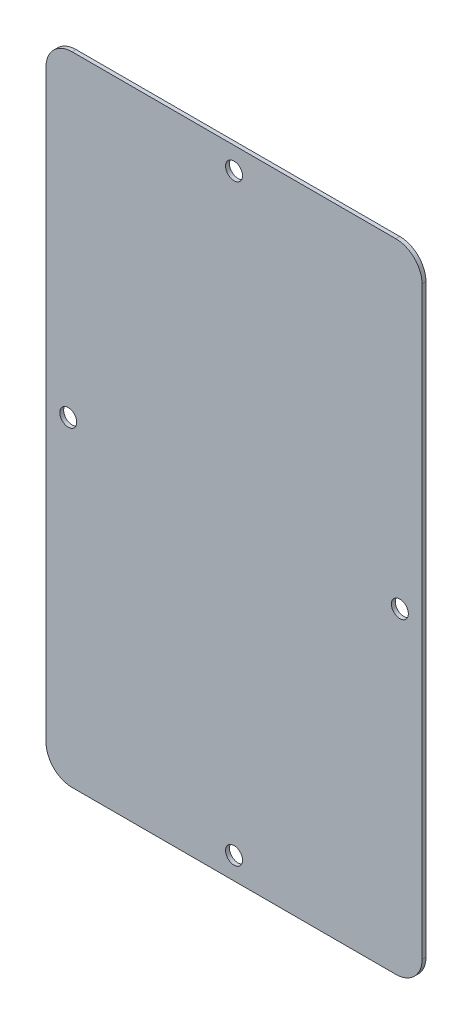
ISO-10303-21;
HEADER;
FILE_DESCRIPTION(('STEP AP214'),'2;1');
FILE_NAME('part.step','',(''),(''),'','','');
FILE_SCHEMA(('AUTOMOTIVE_DESIGN { 1 0 10303 214 1 1 1 1 }'));
ENDSEC;
DATA;
#1=APPLICATION_CONTEXT('core data for automotive mechanical design processes');
#2=APPLICATION_PROTOCOL_DEFINITION('international standard','automotive_design',2000,#1);
#3=PRODUCT_CONTEXT('',#1,'mechanical');
#4=PRODUCT('Part','Part','',(#3));
#5=PRODUCT_RELATED_PRODUCT_CATEGORY('part','',(#4));
#6=PRODUCT_DEFINITION_FORMATION('','',#4);
#7=PRODUCT_DEFINITION_CONTEXT('part definition',#1,'design');
#8=PRODUCT_DEFINITION('design','',#6,#7);
#9=PRODUCT_DEFINITION_SHAPE('','',#8);
#10=(LENGTH_UNIT() NAMED_UNIT(*) SI_UNIT(.MILLI.,.METRE.));
#11=(NAMED_UNIT(*) PLANE_ANGLE_UNIT() SI_UNIT($,.RADIAN.));
#12=(NAMED_UNIT(*) SI_UNIT($,.STERADIAN.) SOLID_ANGLE_UNIT());
#13=UNCERTAINTY_MEASURE_WITH_UNIT(LENGTH_MEASURE(1.E-05),#10,'distance_accuracy_value','');
#14=(GEOMETRIC_REPRESENTATION_CONTEXT(3) GLOBAL_UNCERTAINTY_ASSIGNED_CONTEXT((#13)) GLOBAL_UNIT_ASSIGNED_CONTEXT((#10,
#11,#12)) REPRESENTATION_CONTEXT('',''));
#15=CARTESIAN_POINT('',(0.,0.,0.));
#16=DIRECTION('',(0.,0.,1.));
#17=DIRECTION('',(1.,0.,0.));
#18=AXIS2_PLACEMENT_3D('',#15,#16,#17);
#19=CARTESIAN_POINT('',(0.,0.,-1.5));
#20=DIRECTION('',(-1.,0.,0.));
#21=DIRECTION('',(0.,-1.,0.));
#22=AXIS2_PLACEMENT_3D('',#19,#20,#21);
#23=PLANE('',#22);
#24=DIRECTION('',(0.,-1.,0.));
#25=VECTOR('',#24,1.);
#26=CARTESIAN_POINT('',(0.,0.,0.));
#27=LINE('',#26,#25);
#28=CARTESIAN_POINT('',(-2.77555756156289E-13,234.,0.));
#29=VERTEX_POINT('',#28);
#30=CARTESIAN_POINT('',(0.,9.99999999999999,0.));
#31=VERTEX_POINT('',#30);
#32=EDGE_CURVE('E164',#29,#31,#27,.T.);
#33=ORIENTED_EDGE('',*,*,#32,.F.);
#34=DIRECTION('',(0.,0.,0.999999999999995));
#35=VECTOR('',#34,1.);
#36=CARTESIAN_POINT('',(-2.77555756156289E-13,234.,-1.5));
#37=LINE('',#36,#35);
#38=CARTESIAN_POINT('',(-2.77555756156289E-13,234.,-1.5));
#39=VERTEX_POINT('',#38);
#40=EDGE_CURVE('E144',#29,#39,#37,.F.);
#41=ORIENTED_EDGE('',*,*,#40,.T.);
#42=DIRECTION('',(0.,-1.,0.));
#43=VECTOR('',#42,1.);
#44=CARTESIAN_POINT('',(0.,0.,-1.5));
#45=LINE('',#44,#43);
#46=CARTESIAN_POINT('',(0.,9.99999999999999,-1.5));
#47=VERTEX_POINT('',#46);
#48=EDGE_CURVE('E125',#39,#47,#45,.T.);
#49=ORIENTED_EDGE('',*,*,#48,.T.);
#50=DIRECTION('',(0.,0.,0.999999999999995));
#51=VECTOR('',#50,1.);
#52=CARTESIAN_POINT('',(0.,10.,-1.5));
#53=LINE('',#52,#51);
#54=EDGE_CURVE('E141',#47,#31,#53,.T.);
#55=ORIENTED_EDGE('',*,*,#54,.T.);
#56=EDGE_LOOP('',(#33,#41,#49,#55));
#57=FACE_BOUND('',#56,.T.);
#58=ADVANCED_FACE('F39',(#57),#23,.T.);
#59=CARTESIAN_POINT('',(-2.77555756156289E-13,244.,-1.5));
#60=DIRECTION('',(0.,1.,0.));
#61=DIRECTION('',(0.,0.,0.999999999999995));
#62=AXIS2_PLACEMENT_3D('',#59,#60,#61);
#63=PLANE('',#62);
#64=DIRECTION('',(-1.,0.,0.));
#65=VECTOR('',#64,1.);
#66=CARTESIAN_POINT('',(-2.77555756156289E-13,244.,-1.5));
#67=LINE('',#66,#65);
#68=CARTESIAN_POINT('',(134.,244.,-1.5));
#69=VERTEX_POINT('',#68);
#70=CARTESIAN_POINT('',(9.99999999999973,244.,-1.5));
#71=VERTEX_POINT('',#70);
#72=EDGE_CURVE('E129',#69,#71,#67,.T.);
#73=ORIENTED_EDGE('',*,*,#72,.T.);
#74=DIRECTION('',(0.,0.,0.999999999999995));
#75=VECTOR('',#74,1.);
#76=CARTESIAN_POINT('',(9.99999999999973,244.,-1.5));
#77=LINE('',#76,#75);
#78=CARTESIAN_POINT('',(9.99999999999973,244.,0.));
#79=VERTEX_POINT('',#78);
#80=EDGE_CURVE('E116',#71,#79,#77,.T.);
#81=ORIENTED_EDGE('',*,*,#80,.T.);
#82=DIRECTION('',(-1.,0.,0.));
#83=VECTOR('',#82,1.);
#84=CARTESIAN_POINT('',(-2.77555756156289E-13,244.,0.));
#85=LINE('',#84,#83);
#86=CARTESIAN_POINT('',(134.,244.,0.));
#87=VERTEX_POINT('',#86);
#88=EDGE_CURVE('E108',#87,#79,#85,.T.);
#89=ORIENTED_EDGE('',*,*,#88,.F.);
#90=DIRECTION('',(0.,0.,0.999999999999995));
#91=VECTOR('',#90,1.);
#92=CARTESIAN_POINT('',(134.,244.,-1.5));
#93=LINE('',#92,#91);
#94=EDGE_CURVE('E122',#87,#69,#93,.F.);
#95=ORIENTED_EDGE('',*,*,#94,.T.);
#96=EDGE_LOOP('',(#73,#81,#89,#95));
#97=FACE_BOUND('',#96,.T.);
#98=ADVANCED_FACE('F121',(#97),#63,.T.);
#99=CARTESIAN_POINT('',(144.,0.,-1.5));
#100=DIRECTION('',(1.,0.,0.));
#101=DIRECTION('',(0.,1.,0.));
#102=AXIS2_PLACEMENT_3D('',#99,#100,#101);
#103=PLANE('',#102);
#104=DIRECTION('',(0.,1.,0.));
#105=VECTOR('',#104,1.);
#106=CARTESIAN_POINT('',(144.,0.,0.));
#107=LINE('',#106,#105);
#108=CARTESIAN_POINT('',(144.,10.,0.));
#109=VERTEX_POINT('',#108);
#110=CARTESIAN_POINT('',(144.,234.,0.));
#111=VERTEX_POINT('',#110);
#112=EDGE_CURVE('E110',#109,#111,#107,.T.);
#113=ORIENTED_EDGE('',*,*,#112,.F.);
#114=DIRECTION('',(0.,0.,0.999999999999995));
#115=VECTOR('',#114,1.);
#116=CARTESIAN_POINT('',(144.,10.,-1.5));
#117=LINE('',#116,#115);
#118=CARTESIAN_POINT('',(144.,10.,-1.5));
#119=VERTEX_POINT('',#118);
#120=EDGE_CURVE('E11',#109,#119,#117,.F.);
#121=ORIENTED_EDGE('',*,*,#120,.T.);
#122=DIRECTION('',(0.,1.,0.));
#123=VECTOR('',#122,1.);
#124=CARTESIAN_POINT('',(144.,0.,-1.5));
#125=LINE('',#124,#123);
#126=CARTESIAN_POINT('',(144.,234.,-1.5));
#127=VERTEX_POINT('',#126);
#128=EDGE_CURVE('E132',#119,#127,#125,.T.);
#129=ORIENTED_EDGE('',*,*,#128,.T.);
#130=DIRECTION('',(0.,0.,0.999999999999995));
#131=VECTOR('',#130,1.);
#132=CARTESIAN_POINT('',(144.,234.,-1.5));
#133=LINE('',#132,#131);
#134=EDGE_CURVE('E47',#127,#111,#133,.T.);
#135=ORIENTED_EDGE('',*,*,#134,.T.);
#136=EDGE_LOOP('',(#113,#121,#129,#135));
#137=FACE_BOUND('',#136,.T.);
#138=ADVANCED_FACE('F157',(#137),#103,.T.);
#139=CARTESIAN_POINT('',(0.,0.,-1.5));
#140=DIRECTION('',(0.,-1.,0.));
#141=DIRECTION('',(0.,0.,-0.999999999999995));
#142=AXIS2_PLACEMENT_3D('',#139,#140,#141);
#143=PLANE('',#142);
#144=DIRECTION('',(1.,0.,0.));
#145=VECTOR('',#144,1.);
#146=CARTESIAN_POINT('',(0.,0.,0.));
#147=LINE('',#146,#145);
#148=CARTESIAN_POINT('',(10.,0.,0.));
#149=VERTEX_POINT('',#148);
#150=CARTESIAN_POINT('',(134.,0.,0.));
#151=VERTEX_POINT('',#150);
#152=EDGE_CURVE('E167',#149,#151,#147,.T.);
#153=ORIENTED_EDGE('',*,*,#152,.F.);
#154=DIRECTION('',(0.,0.,0.999999999999995));
#155=VECTOR('',#154,1.);
#156=CARTESIAN_POINT('',(10.,0.,-1.5));
#157=LINE('',#156,#155);
#158=CARTESIAN_POINT('',(10.,0.,-1.5));
#159=VERTEX_POINT('',#158);
#160=EDGE_CURVE('E61',#149,#159,#157,.F.);
#161=ORIENTED_EDGE('',*,*,#160,.T.);
#162=DIRECTION('',(1.,0.,0.));
#163=VECTOR('',#162,1.);
#164=CARTESIAN_POINT('',(0.,0.,-1.5));
#165=LINE('',#164,#163);
#166=CARTESIAN_POINT('',(134.,0.,-1.5));
#167=VERTEX_POINT('',#166);
#168=EDGE_CURVE('E159',#159,#167,#165,.T.);
#169=ORIENTED_EDGE('',*,*,#168,.T.);
#170=DIRECTION('',(0.,0.,0.999999999999995));
#171=VECTOR('',#170,1.);
#172=CARTESIAN_POINT('',(134.,0.,-1.5));
#173=LINE('',#172,#171);
#174=EDGE_CURVE('E152',#167,#151,#173,.T.);
#175=ORIENTED_EDGE('',*,*,#174,.T.);
#176=EDGE_LOOP('',(#153,#161,#169,#175));
#177=FACE_BOUND('',#176,.T.);
#178=ADVANCED_FACE('F170',(#177),#143,.T.);
#179=CARTESIAN_POINT('',(0.,0.,-1.5));
#180=DIRECTION('',(0.,0.,-0.999999999999995));
#181=DIRECTION('',(-1.,0.,0.));
#182=AXIS2_PLACEMENT_3D('',#179,#180,#181);
#183=PLANE('',#182);
#184=CARTESIAN_POINT('',(72.,235.5,-1.5));
#185=DIRECTION('',(0.,0.,-0.999999999999995));
#186=DIRECTION('',(-1.,0.,0.));
#187=AXIS2_PLACEMENT_3D('',#184,#185,#186);
#188=CIRCLE('',#187,3.25000000000001);
#189=CARTESIAN_POINT('',(75.25,235.5,-1.5));
#190=VERTEX_POINT('',#189);
#191=EDGE_CURVE('E168',#190,#190,#188,.T.);
#192=ORIENTED_EDGE('',*,*,#191,.F.);
#193=EDGE_LOOP('',(#192));
#194=FACE_BOUND('',#193,.T.);
#195=CARTESIAN_POINT('',(72.,8.5,-1.5));
#196=DIRECTION('',(0.,0.,-0.999999999999995));
#197=DIRECTION('',(-1.,0.,0.));
#198=AXIS2_PLACEMENT_3D('',#195,#196,#197);
#199=CIRCLE('',#198,3.25000000000001);
#200=CARTESIAN_POINT('',(75.25,8.5,-1.5));
#201=VERTEX_POINT('',#200);
#202=EDGE_CURVE('E186',#201,#201,#199,.T.);
#203=ORIENTED_EDGE('',*,*,#202,.F.);
#204=EDGE_LOOP('',(#203));
#205=FACE_BOUND('',#204,.T.);
#206=CARTESIAN_POINT('',(8.49999999999995,122.,-1.5));
#207=DIRECTION('',(0.,0.,-0.999999999999995));
#208=DIRECTION('',(-1.,0.,0.));
#209=AXIS2_PLACEMENT_3D('',#206,#207,#208);
#210=CIRCLE('',#209,3.25);
#211=CARTESIAN_POINT('',(11.75,122.,-1.5));
#212=VERTEX_POINT('',#211);
#213=EDGE_CURVE('E189',#212,#212,#210,.T.);
#214=ORIENTED_EDGE('',*,*,#213,.F.);
#215=EDGE_LOOP('',(#214));
#216=FACE_BOUND('',#215,.T.);
#217=CARTESIAN_POINT('',(135.5,122.,-1.5));
#218=DIRECTION('',(0.,0.,-0.999999999999995));
#219=DIRECTION('',(-1.,0.,0.));
#220=AXIS2_PLACEMENT_3D('',#217,#218,#219);
#221=CIRCLE('',#220,3.25000000000001);
#222=CARTESIAN_POINT('',(138.75,122.,-1.5));
#223=VERTEX_POINT('',#222);
#224=EDGE_CURVE('E192',#223,#223,#221,.T.);
#225=ORIENTED_EDGE('',*,*,#224,.F.);
#226=EDGE_LOOP('',(#225));
#227=FACE_BOUND('',#226,.T.);
#228=ORIENTED_EDGE('',*,*,#48,.F.);
#229=CARTESIAN_POINT('',(9.99999999999973,234.,-1.5));
#230=DIRECTION('',(0.,0.,-0.999999999999995));
#231=DIRECTION('',(-1.,0.,0.));
#232=AXIS2_PLACEMENT_3D('',#229,#230,#231);
#233=CIRCLE('',#232,10.);
#234=EDGE_CURVE('E150',#39,#71,#233,.T.);
#235=ORIENTED_EDGE('',*,*,#234,.T.);
#236=ORIENTED_EDGE('',*,*,#72,.F.);
#237=CARTESIAN_POINT('',(134.,234.,-1.5));
#238=DIRECTION('',(0.,0.,-0.999999999999995));
#239=DIRECTION('',(-1.,0.,0.));
#240=AXIS2_PLACEMENT_3D('',#237,#238,#239);
#241=CIRCLE('',#240,10.);
#242=EDGE_CURVE('E128',#69,#127,#241,.T.);
#243=ORIENTED_EDGE('',*,*,#242,.T.);
#244=ORIENTED_EDGE('',*,*,#128,.F.);
#245=CARTESIAN_POINT('',(134.,10.,-1.5));
#246=DIRECTION('',(0.,0.,-0.999999999999995));
#247=DIRECTION('',(-1.,0.,0.));
#248=AXIS2_PLACEMENT_3D('',#245,#246,#247);
#249=CIRCLE('',#248,10.);
#250=EDGE_CURVE('E54',#119,#167,#249,.T.);
#251=ORIENTED_EDGE('',*,*,#250,.T.);
#252=ORIENTED_EDGE('',*,*,#168,.F.);
#253=CARTESIAN_POINT('',(10.,10.,-1.5));
#254=DIRECTION('',(0.,0.,-0.999999999999995));
#255=DIRECTION('',(-1.,0.,0.));
#256=AXIS2_PLACEMENT_3D('',#253,#254,#255);
#257=CIRCLE('',#256,10.);
#258=EDGE_CURVE('E148',#159,#47,#257,.T.);
#259=ORIENTED_EDGE('',*,*,#258,.T.);
#260=EDGE_LOOP('',(#228,#235,#236,#243,#244,#251,#252,#259));
#261=FACE_BOUND('',#260,.T.);
#262=ADVANCED_FACE('F178',(#194,#205,#216,#227,#261),#183,.T.);
#263=CARTESIAN_POINT('',(0.,0.,0.));
#264=DIRECTION('',(0.,0.,-0.999999999999995));
#265=DIRECTION('',(-1.,0.,0.));
#266=AXIS2_PLACEMENT_3D('',#263,#264,#265);
#267=PLANE('',#266);
#268=CARTESIAN_POINT('',(72.,235.5,0.));
#269=DIRECTION('',(0.,0.,0.999999999999995));
#270=DIRECTION('',(1.,0.,0.));
#271=AXIS2_PLACEMENT_3D('',#268,#269,#270);
#272=CIRCLE('',#271,3.25000000000001);
#273=CARTESIAN_POINT('',(75.25,235.5,0.));
#274=VERTEX_POINT('',#273);
#275=EDGE_CURVE('E195',#274,#274,#272,.T.);
#276=ORIENTED_EDGE('',*,*,#275,.F.);
#277=EDGE_LOOP('',(#276));
#278=FACE_BOUND('',#277,.T.);
#279=CARTESIAN_POINT('',(72.,8.5,0.));
#280=DIRECTION('',(0.,0.,0.999999999999995));
#281=DIRECTION('',(1.,0.,0.));
#282=AXIS2_PLACEMENT_3D('',#279,#280,#281);
#283=CIRCLE('',#282,3.25000000000001);
#284=CARTESIAN_POINT('',(75.25,8.5,0.));
#285=VERTEX_POINT('',#284);
#286=EDGE_CURVE('E202',#285,#285,#283,.T.);
#287=ORIENTED_EDGE('',*,*,#286,.F.);
#288=EDGE_LOOP('',(#287));
#289=FACE_BOUND('',#288,.T.);
#290=CARTESIAN_POINT('',(8.49999999999995,122.,0.));
#291=DIRECTION('',(0.,0.,0.999999999999995));
#292=DIRECTION('',(1.,0.,0.));
#293=AXIS2_PLACEMENT_3D('',#290,#291,#292);
#294=CIRCLE('',#293,3.25);
#295=CARTESIAN_POINT('',(11.75,122.,0.));
#296=VERTEX_POINT('',#295);
#297=EDGE_CURVE('E199',#296,#296,#294,.T.);
#298=ORIENTED_EDGE('',*,*,#297,.F.);
#299=EDGE_LOOP('',(#298));
#300=FACE_BOUND('',#299,.T.);
#301=CARTESIAN_POINT('',(135.5,122.,0.));
#302=DIRECTION('',(0.,0.,0.999999999999995));
#303=DIRECTION('',(1.,0.,0.));
#304=AXIS2_PLACEMENT_3D('',#301,#302,#303);
#305=CIRCLE('',#304,3.25000000000001);
#306=CARTESIAN_POINT('',(138.75,122.,0.));
#307=VERTEX_POINT('',#306);
#308=EDGE_CURVE('E196',#307,#307,#305,.T.);
#309=ORIENTED_EDGE('',*,*,#308,.F.);
#310=EDGE_LOOP('',(#309));
#311=FACE_BOUND('',#310,.T.);
#312=ORIENTED_EDGE('',*,*,#88,.T.);
#313=CARTESIAN_POINT('',(9.99999999999973,234.,0.));
#314=DIRECTION('',(0.,0.,-0.999999999999995));
#315=DIRECTION('',(-1.,0.,0.));
#316=AXIS2_PLACEMENT_3D('',#313,#314,#315);
#317=CIRCLE('',#316,10.);
#318=EDGE_CURVE('E139',#79,#29,#317,.F.);
#319=ORIENTED_EDGE('',*,*,#318,.T.);
#320=ORIENTED_EDGE('',*,*,#32,.T.);
#321=CARTESIAN_POINT('',(10.,10.,0.));
#322=DIRECTION('',(0.,0.,-0.999999999999995));
#323=DIRECTION('',(-1.,0.,0.));
#324=AXIS2_PLACEMENT_3D('',#321,#322,#323);
#325=CIRCLE('',#324,10.);
#326=EDGE_CURVE('E137',#31,#149,#325,.F.);
#327=ORIENTED_EDGE('',*,*,#326,.T.);
#328=ORIENTED_EDGE('',*,*,#152,.T.);
#329=CARTESIAN_POINT('',(134.,10.,0.));
#330=DIRECTION('',(0.,0.,-0.999999999999995));
#331=DIRECTION('',(-1.,0.,0.));
#332=AXIS2_PLACEMENT_3D('',#329,#330,#331);
#333=CIRCLE('',#332,10.);
#334=EDGE_CURVE('E115',#151,#109,#333,.F.);
#335=ORIENTED_EDGE('',*,*,#334,.T.);
#336=ORIENTED_EDGE('',*,*,#112,.T.);
#337=CARTESIAN_POINT('',(134.,234.,0.));
#338=DIRECTION('',(0.,0.,-0.999999999999995));
#339=DIRECTION('',(-1.,0.,0.));
#340=AXIS2_PLACEMENT_3D('',#337,#338,#339);
#341=CIRCLE('',#340,10.);
#342=EDGE_CURVE('E105',#111,#87,#341,.F.);
#343=ORIENTED_EDGE('',*,*,#342,.T.);
#344=EDGE_LOOP('',(#312,#319,#320,#327,#328,#335,#336,#343));
#345=FACE_BOUND('',#344,.T.);
#346=ADVANCED_FACE('F107',(#278,#289,#300,#311,#345),#267,.F.);
#347=CARTESIAN_POINT('',(9.99999999999973,234.,-1.5));
#348=DIRECTION('',(0.,0.,0.999999999999995));
#349=DIRECTION('',(1.,0.,0.));
#350=AXIS2_PLACEMENT_3D('',#347,#348,#349);
#351=CYLINDRICAL_SURFACE('',#350,10.);
#352=ORIENTED_EDGE('',*,*,#234,.F.);
#353=ORIENTED_EDGE('',*,*,#40,.F.);
#354=ORIENTED_EDGE('',*,*,#318,.F.);
#355=ORIENTED_EDGE('',*,*,#80,.F.);
#356=EDGE_LOOP('',(#352,#353,#354,#355));
#357=FACE_BOUND('',#356,.T.);
#358=ADVANCED_FACE('F212',(#357),#351,.T.);
#359=CARTESIAN_POINT('',(10.,10.,-1.5));
#360=DIRECTION('',(0.,0.,0.999999999999995));
#361=DIRECTION('',(1.,0.,0.));
#362=AXIS2_PLACEMENT_3D('',#359,#360,#361);
#363=CYLINDRICAL_SURFACE('',#362,10.);
#364=ORIENTED_EDGE('',*,*,#258,.F.);
#365=ORIENTED_EDGE('',*,*,#160,.F.);
#366=ORIENTED_EDGE('',*,*,#326,.F.);
#367=ORIENTED_EDGE('',*,*,#54,.F.);
#368=EDGE_LOOP('',(#364,#365,#366,#367));
#369=FACE_BOUND('',#368,.T.);
#370=ADVANCED_FACE('F174',(#369),#363,.T.);
#371=CARTESIAN_POINT('',(134.,10.,-1.5));
#372=DIRECTION('',(0.,0.,0.999999999999995));
#373=DIRECTION('',(1.,0.,0.));
#374=AXIS2_PLACEMENT_3D('',#371,#372,#373);
#375=CYLINDRICAL_SURFACE('',#374,10.);
#376=ORIENTED_EDGE('',*,*,#250,.F.);
#377=ORIENTED_EDGE('',*,*,#120,.F.);
#378=ORIENTED_EDGE('',*,*,#334,.F.);
#379=ORIENTED_EDGE('',*,*,#174,.F.);
#380=EDGE_LOOP('',(#376,#377,#378,#379));
#381=FACE_BOUND('',#380,.T.);
#382=ADVANCED_FACE('F232',(#381),#375,.T.);
#383=CARTESIAN_POINT('',(134.,234.,-1.5));
#384=DIRECTION('',(0.,0.,0.999999999999995));
#385=DIRECTION('',(1.,0.,0.));
#386=AXIS2_PLACEMENT_3D('',#383,#384,#385);
#387=CYLINDRICAL_SURFACE('',#386,10.);
#388=ORIENTED_EDGE('',*,*,#242,.F.);
#389=ORIENTED_EDGE('',*,*,#94,.F.);
#390=ORIENTED_EDGE('',*,*,#342,.F.);
#391=ORIENTED_EDGE('',*,*,#134,.F.);
#392=EDGE_LOOP('',(#388,#389,#390,#391));
#393=FACE_BOUND('',#392,.T.);
#394=ADVANCED_FACE('F41',(#393),#387,.T.);
#395=CARTESIAN_POINT('',(135.5,122.,-10.));
#396=DIRECTION('',(0.,0.,0.999999999999995));
#397=DIRECTION('',(1.,0.,0.));
#398=AXIS2_PLACEMENT_3D('',#395,#396,#397);
#399=CYLINDRICAL_SURFACE('',#398,3.25000000000001);
#400=CARTESIAN_POINT('',(138.75,122.,-1.5));
#401=CARTESIAN_POINT('',(138.75,122.,-1.484375));
#402=CARTESIAN_POINT('',(138.75,122.,-1.46875));
#403=CARTESIAN_POINT('',(138.75,122.,-1.4375));
#404=CARTESIAN_POINT('',(138.75,122.,-1.421875));
#405=CARTESIAN_POINT('',(138.75,122.,-1.390625));
#406=CARTESIAN_POINT('',(138.75,122.,-1.375));
#407=CARTESIAN_POINT('',(138.75,122.,-1.34375));
#408=CARTESIAN_POINT('',(138.75,122.,-1.328125));
#409=CARTESIAN_POINT('',(138.75,122.,-1.296875));
#410=CARTESIAN_POINT('',(138.75,122.,-1.28125));
#411=CARTESIAN_POINT('',(138.75,122.,-1.25));
#412=CARTESIAN_POINT('',(138.75,122.,-1.234375));
#413=CARTESIAN_POINT('',(138.75,122.,-1.203125));
#414=CARTESIAN_POINT('',(138.75,122.,-1.1875));
#415=CARTESIAN_POINT('',(138.75,122.,-1.15625));
#416=CARTESIAN_POINT('',(138.75,122.,-1.140625));
#417=CARTESIAN_POINT('',(138.75,122.,-1.109375));
#418=CARTESIAN_POINT('',(138.75,122.,-1.09375));
#419=CARTESIAN_POINT('',(138.75,122.,-1.0625));
#420=CARTESIAN_POINT('',(138.75,122.,-1.046875));
#421=CARTESIAN_POINT('',(138.75,122.,-1.015625));
#422=CARTESIAN_POINT('',(138.75,122.,-1.));
#423=CARTESIAN_POINT('',(138.75,122.,-0.968750000000001));
#424=CARTESIAN_POINT('',(138.75,122.,-0.953125000000001));
#425=CARTESIAN_POINT('',(138.75,122.,-0.921875000000001));
#426=CARTESIAN_POINT('',(138.75,122.,-0.906250000000001));
#427=CARTESIAN_POINT('',(138.75,122.,-0.875));
#428=CARTESIAN_POINT('',(138.75,122.,-0.859375));
#429=CARTESIAN_POINT('',(138.75,122.,-0.828124999999999));
#430=CARTESIAN_POINT('',(138.75,122.,-0.812499999999999));
#431=CARTESIAN_POINT('',(138.75,122.,-0.781249999999999));
#432=CARTESIAN_POINT('',(138.75,122.,-0.765624999999999));
#433=CARTESIAN_POINT('',(138.75,122.,-0.734374999999999));
#434=CARTESIAN_POINT('',(138.75,122.,-0.71875));
#435=CARTESIAN_POINT('',(138.75,122.,-0.687500000000001));
#436=CARTESIAN_POINT('',(138.75,122.,-0.671875000000001));
#437=CARTESIAN_POINT('',(138.75,122.,-0.640625));
#438=CARTESIAN_POINT('',(138.75,122.,-0.624999999999999));
#439=CARTESIAN_POINT('',(138.75,122.,-0.593749999999999));
#440=CARTESIAN_POINT('',(138.75,122.,-0.578124999999999));
#441=CARTESIAN_POINT('',(138.75,122.,-0.546874999999999));
#442=CARTESIAN_POINT('',(138.75,122.,-0.531249999999999));
#443=CARTESIAN_POINT('',(138.75,122.,-0.499999999999999));
#444=CARTESIAN_POINT('',(138.75,122.,-0.484374999999999));
#445=CARTESIAN_POINT('',(138.75,122.,-0.453124999999999));
#446=CARTESIAN_POINT('',(138.75,122.,-0.437499999999999));
#447=CARTESIAN_POINT('',(138.75,122.,-0.406249999999999));
#448=CARTESIAN_POINT('',(138.75,122.,-0.390625));
#449=CARTESIAN_POINT('',(138.75,122.,-0.359375));
#450=CARTESIAN_POINT('',(138.75,122.,-0.343749999999999));
#451=CARTESIAN_POINT('',(138.75,122.,-0.312499999999999));
#452=CARTESIAN_POINT('',(138.75,122.,-0.296874999999999));
#453=CARTESIAN_POINT('',(138.75,122.,-0.265624999999999));
#454=CARTESIAN_POINT('',(138.75,122.,-0.249999999999999));
#455=CARTESIAN_POINT('',(138.75,122.,-0.218749999999998));
#456=CARTESIAN_POINT('',(138.75,122.,-0.203124999999998));
#457=CARTESIAN_POINT('',(138.75,122.,-0.171874999999998));
#458=CARTESIAN_POINT('',(138.75,122.,-0.156249999999998));
#459=CARTESIAN_POINT('',(138.75,122.,-0.124999999999998));
#460=CARTESIAN_POINT('',(138.75,122.,-0.109374999999997));
#461=CARTESIAN_POINT('',(138.75,122.,-0.0781249999999972));
#462=CARTESIAN_POINT('',(138.75,122.,-0.0624999999999977));
#463=CARTESIAN_POINT('',(138.75,122.,-0.0312499999999983));
#464=CARTESIAN_POINT('',(138.75,122.,-0.0156249999999983));
#465=CARTESIAN_POINT('',(138.75,122.,0.));
#466=B_SPLINE_CURVE_WITH_KNOTS('',3,(#400,#401,#402,#403,#404,#405,#406,#407,#408,#409,#410,
#411,#412,#413,#414,#415,#416,#417,#418,#419,#420,#421,#422,#423,#424,#425,#426,#427,#428,#429,
#430,#431,#432,#433,#434,#435,#436,#437,#438,#439,#440,#441,#442,#443,#444,#445,#446,#447,#448,
#449,#450,#451,#452,#453,#454,#455,#456,#457,#458,#459,#460,#461,#462,#463,#464,#465),
.UNSPECIFIED.,.F.,.F.,(4,2,2,2,2,2,2,2,2,2,2,2,2,2,2,2,2,2,2,2,2,2,2,2,2,2,2,2,2,2,2,2,4),(0.,
0.046875,0.0937500000000001,0.140625,0.1875,0.234375,0.28125,0.328125,0.375000000000002,
0.421875000000002,0.46875,0.515625,0.5625,0.609375000000001,0.656250000000002,0.703125000000002,
0.750000000000002,0.796875000000001,0.843750000000001,0.890625000000003,0.937500000000003,
0.984375000000003,1.03125,1.078125,1.125,1.171875,1.21875,1.265625,1.3125,1.359375,1.40625,
1.453125,1.5),.UNSPECIFIED.);
#467=EDGE_CURVE('BSEAM220',#223,#307,#466,.T.);
#468=ORIENTED_EDGE('',*,*,#224,.T.);
#469=ORIENTED_EDGE('',*,*,#308,.T.);
#470=ORIENTED_EDGE('',*,*,#467,.T.);
#471=ORIENTED_EDGE('',*,*,#467,.F.);
#472=EDGE_LOOP('',(#468,#470,#469,#471));
#473=FACE_BOUND('',#472,.T.);
#474=ADVANCED_FACE('F220',(#473),#399,.F.);
#475=CARTESIAN_POINT('',(8.49999999999995,122.,-10.));
#476=DIRECTION('',(0.,0.,0.999999999999995));
#477=DIRECTION('',(1.,0.,0.));
#478=AXIS2_PLACEMENT_3D('',#475,#476,#477);
#479=CYLINDRICAL_SURFACE('',#478,3.25);
#480=CARTESIAN_POINT('',(11.75,122.,-1.5));
#481=CARTESIAN_POINT('',(11.75,122.,-1.484375));
#482=CARTESIAN_POINT('',(11.75,122.,-1.46875));
#483=CARTESIAN_POINT('',(11.75,122.,-1.4375));
#484=CARTESIAN_POINT('',(11.75,122.,-1.421875));
#485=CARTESIAN_POINT('',(11.75,122.,-1.390625));
#486=CARTESIAN_POINT('',(11.75,122.,-1.375));
#487=CARTESIAN_POINT('',(11.75,122.,-1.34375));
#488=CARTESIAN_POINT('',(11.75,122.,-1.328125));
#489=CARTESIAN_POINT('',(11.75,122.,-1.296875));
#490=CARTESIAN_POINT('',(11.75,122.,-1.28125));
#491=CARTESIAN_POINT('',(11.75,122.,-1.25));
#492=CARTESIAN_POINT('',(11.75,122.,-1.234375));
#493=CARTESIAN_POINT('',(11.75,122.,-1.203125));
#494=CARTESIAN_POINT('',(11.75,122.,-1.1875));
#495=CARTESIAN_POINT('',(11.75,122.,-1.15625));
#496=CARTESIAN_POINT('',(11.75,122.,-1.140625));
#497=CARTESIAN_POINT('',(11.75,122.,-1.109375));
#498=CARTESIAN_POINT('',(11.75,122.,-1.09375));
#499=CARTESIAN_POINT('',(11.75,122.,-1.0625));
#500=CARTESIAN_POINT('',(11.75,122.,-1.046875));
#501=CARTESIAN_POINT('',(11.75,122.,-1.015625));
#502=CARTESIAN_POINT('',(11.75,122.,-1.));
#503=CARTESIAN_POINT('',(11.75,122.,-0.968750000000001));
#504=CARTESIAN_POINT('',(11.75,122.,-0.953125000000001));
#505=CARTESIAN_POINT('',(11.75,122.,-0.921875000000001));
#506=CARTESIAN_POINT('',(11.75,122.,-0.906250000000001));
#507=CARTESIAN_POINT('',(11.75,122.,-0.875));
#508=CARTESIAN_POINT('',(11.75,122.,-0.859375));
#509=CARTESIAN_POINT('',(11.75,122.,-0.828124999999999));
#510=CARTESIAN_POINT('',(11.75,122.,-0.812499999999999));
#511=CARTESIAN_POINT('',(11.75,122.,-0.781249999999999));
#512=CARTESIAN_POINT('',(11.75,122.,-0.765624999999999));
#513=CARTESIAN_POINT('',(11.75,122.,-0.734374999999999));
#514=CARTESIAN_POINT('',(11.75,122.,-0.71875));
#515=CARTESIAN_POINT('',(11.75,122.,-0.687500000000001));
#516=CARTESIAN_POINT('',(11.75,122.,-0.671875000000001));
#517=CARTESIAN_POINT('',(11.75,122.,-0.640625));
#518=CARTESIAN_POINT('',(11.75,122.,-0.624999999999999));
#519=CARTESIAN_POINT('',(11.75,122.,-0.593749999999999));
#520=CARTESIAN_POINT('',(11.75,122.,-0.578124999999999));
#521=CARTESIAN_POINT('',(11.75,122.,-0.546874999999999));
#522=CARTESIAN_POINT('',(11.75,122.,-0.531249999999999));
#523=CARTESIAN_POINT('',(11.75,122.,-0.499999999999999));
#524=CARTESIAN_POINT('',(11.75,122.,-0.484374999999999));
#525=CARTESIAN_POINT('',(11.75,122.,-0.453124999999999));
#526=CARTESIAN_POINT('',(11.75,122.,-0.437499999999999));
#527=CARTESIAN_POINT('',(11.75,122.,-0.406249999999999));
#528=CARTESIAN_POINT('',(11.75,122.,-0.390625));
#529=CARTESIAN_POINT('',(11.75,122.,-0.359375));
#530=CARTESIAN_POINT('',(11.75,122.,-0.343749999999999));
#531=CARTESIAN_POINT('',(11.75,122.,-0.312499999999999));
#532=CARTESIAN_POINT('',(11.75,122.,-0.296874999999999));
#533=CARTESIAN_POINT('',(11.75,122.,-0.265624999999999));
#534=CARTESIAN_POINT('',(11.75,122.,-0.249999999999999));
#535=CARTESIAN_POINT('',(11.75,122.,-0.218749999999998));
#536=CARTESIAN_POINT('',(11.75,122.,-0.203124999999998));
#537=CARTESIAN_POINT('',(11.75,122.,-0.171874999999998));
#538=CARTESIAN_POINT('',(11.75,122.,-0.156249999999998));
#539=CARTESIAN_POINT('',(11.75,122.,-0.124999999999998));
#540=CARTESIAN_POINT('',(11.75,122.,-0.109374999999997));
#541=CARTESIAN_POINT('',(11.75,122.,-0.0781249999999972));
#542=CARTESIAN_POINT('',(11.75,122.,-0.0624999999999977));
#543=CARTESIAN_POINT('',(11.75,122.,-0.0312499999999983));
#544=CARTESIAN_POINT('',(11.75,122.,-0.0156249999999983));
#545=CARTESIAN_POINT('',(11.75,122.,0.));
#546=B_SPLINE_CURVE_WITH_KNOTS('',3,(#480,#481,#482,#483,#484,#485,#486,#487,#488,#489,#490,
#491,#492,#493,#494,#495,#496,#497,#498,#499,#500,#501,#502,#503,#504,#505,#506,#507,#508,#509,
#510,#511,#512,#513,#514,#515,#516,#517,#518,#519,#520,#521,#522,#523,#524,#525,#526,#527,#528,
#529,#530,#531,#532,#533,#534,#535,#536,#537,#538,#539,#540,#541,#542,#543,#544,#545),
.UNSPECIFIED.,.F.,.F.,(4,2,2,2,2,2,2,2,2,2,2,2,2,2,2,2,2,2,2,2,2,2,2,2,2,2,2,2,2,2,2,2,4),(0.,
0.046875,0.0937500000000001,0.140625,0.1875,0.234375,0.28125,0.328125,0.375000000000002,
0.421875000000002,0.46875,0.515625,0.5625,0.609375000000001,0.656250000000002,0.703125000000002,
0.750000000000002,0.796875000000001,0.843750000000001,0.890625000000003,0.937500000000003,
0.984375000000003,1.03125,1.078125,1.125,1.171875,1.21875,1.265625,1.3125,1.359375,1.40625,
1.453125,1.5),.UNSPECIFIED.);
#547=EDGE_CURVE('BSEAM222',#212,#296,#546,.T.);
#548=ORIENTED_EDGE('',*,*,#213,.T.);
#549=ORIENTED_EDGE('',*,*,#297,.T.);
#550=ORIENTED_EDGE('',*,*,#547,.T.);
#551=ORIENTED_EDGE('',*,*,#547,.F.);
#552=EDGE_LOOP('',(#548,#550,#549,#551));
#553=FACE_BOUND('',#552,.T.);
#554=ADVANCED_FACE('F222',(#553),#479,.F.);
#555=CARTESIAN_POINT('',(72.,8.5,-10.));
#556=DIRECTION('',(0.,0.,0.999999999999995));
#557=DIRECTION('',(1.,0.,0.));
#558=AXIS2_PLACEMENT_3D('',#555,#556,#557);
#559=CYLINDRICAL_SURFACE('',#558,3.25000000000001);
#560=CARTESIAN_POINT('',(75.25,8.5,-1.5));
#561=CARTESIAN_POINT('',(75.25,8.5,-1.484375));
#562=CARTESIAN_POINT('',(75.25,8.5,-1.46875));
#563=CARTESIAN_POINT('',(75.25,8.5,-1.4375));
#564=CARTESIAN_POINT('',(75.25,8.5,-1.421875));
#565=CARTESIAN_POINT('',(75.25,8.5,-1.390625));
#566=CARTESIAN_POINT('',(75.25,8.5,-1.375));
#567=CARTESIAN_POINT('',(75.25,8.5,-1.34375));
#568=CARTESIAN_POINT('',(75.25,8.5,-1.328125));
#569=CARTESIAN_POINT('',(75.25,8.5,-1.296875));
#570=CARTESIAN_POINT('',(75.25,8.5,-1.28125));
#571=CARTESIAN_POINT('',(75.25,8.5,-1.25));
#572=CARTESIAN_POINT('',(75.25,8.5,-1.234375));
#573=CARTESIAN_POINT('',(75.25,8.5,-1.203125));
#574=CARTESIAN_POINT('',(75.25,8.5,-1.1875));
#575=CARTESIAN_POINT('',(75.25,8.5,-1.15625));
#576=CARTESIAN_POINT('',(75.25,8.5,-1.140625));
#577=CARTESIAN_POINT('',(75.25,8.5,-1.109375));
#578=CARTESIAN_POINT('',(75.25,8.5,-1.09375));
#579=CARTESIAN_POINT('',(75.25,8.5,-1.0625));
#580=CARTESIAN_POINT('',(75.25,8.5,-1.046875));
#581=CARTESIAN_POINT('',(75.25,8.5,-1.015625));
#582=CARTESIAN_POINT('',(75.25,8.5,-1.));
#583=CARTESIAN_POINT('',(75.25,8.5,-0.968750000000001));
#584=CARTESIAN_POINT('',(75.25,8.5,-0.953125000000001));
#585=CARTESIAN_POINT('',(75.25,8.5,-0.921875000000001));
#586=CARTESIAN_POINT('',(75.25,8.5,-0.906250000000001));
#587=CARTESIAN_POINT('',(75.25,8.5,-0.875));
#588=CARTESIAN_POINT('',(75.25,8.5,-0.859375));
#589=CARTESIAN_POINT('',(75.25,8.5,-0.828124999999999));
#590=CARTESIAN_POINT('',(75.25,8.5,-0.812499999999999));
#591=CARTESIAN_POINT('',(75.25,8.5,-0.781249999999999));
#592=CARTESIAN_POINT('',(75.25,8.5,-0.765624999999999));
#593=CARTESIAN_POINT('',(75.25,8.5,-0.734374999999999));
#594=CARTESIAN_POINT('',(75.25,8.5,-0.71875));
#595=CARTESIAN_POINT('',(75.25,8.5,-0.687500000000001));
#596=CARTESIAN_POINT('',(75.25,8.5,-0.671875000000001));
#597=CARTESIAN_POINT('',(75.25,8.5,-0.640625));
#598=CARTESIAN_POINT('',(75.25,8.5,-0.624999999999999));
#599=CARTESIAN_POINT('',(75.25,8.5,-0.593749999999999));
#600=CARTESIAN_POINT('',(75.25,8.5,-0.578124999999999));
#601=CARTESIAN_POINT('',(75.25,8.5,-0.546874999999999));
#602=CARTESIAN_POINT('',(75.25,8.5,-0.531249999999999));
#603=CARTESIAN_POINT('',(75.25,8.5,-0.499999999999999));
#604=CARTESIAN_POINT('',(75.25,8.5,-0.484374999999999));
#605=CARTESIAN_POINT('',(75.25,8.5,-0.453124999999999));
#606=CARTESIAN_POINT('',(75.25,8.5,-0.437499999999999));
#607=CARTESIAN_POINT('',(75.25,8.5,-0.406249999999999));
#608=CARTESIAN_POINT('',(75.25,8.5,-0.390625));
#609=CARTESIAN_POINT('',(75.25,8.5,-0.359375));
#610=CARTESIAN_POINT('',(75.25,8.5,-0.343749999999999));
#611=CARTESIAN_POINT('',(75.25,8.5,-0.312499999999999));
#612=CARTESIAN_POINT('',(75.25,8.5,-0.296874999999999));
#613=CARTESIAN_POINT('',(75.25,8.5,-0.265624999999999));
#614=CARTESIAN_POINT('',(75.25,8.5,-0.249999999999999));
#615=CARTESIAN_POINT('',(75.25,8.5,-0.218749999999998));
#616=CARTESIAN_POINT('',(75.25,8.5,-0.203124999999998));
#617=CARTESIAN_POINT('',(75.25,8.5,-0.171874999999998));
#618=CARTESIAN_POINT('',(75.25,8.5,-0.156249999999998));
#619=CARTESIAN_POINT('',(75.25,8.5,-0.124999999999998));
#620=CARTESIAN_POINT('',(75.25,8.5,-0.109374999999997));
#621=CARTESIAN_POINT('',(75.25,8.5,-0.0781249999999972));
#622=CARTESIAN_POINT('',(75.25,8.5,-0.0624999999999977));
#623=CARTESIAN_POINT('',(75.25,8.5,-0.0312499999999983));
#624=CARTESIAN_POINT('',(75.25,8.5,-0.0156249999999983));
#625=CARTESIAN_POINT('',(75.25,8.5,0.));
#626=B_SPLINE_CURVE_WITH_KNOTS('',3,(#560,#561,#562,#563,#564,#565,#566,#567,#568,#569,#570,
#571,#572,#573,#574,#575,#576,#577,#578,#579,#580,#581,#582,#583,#584,#585,#586,#587,#588,#589,
#590,#591,#592,#593,#594,#595,#596,#597,#598,#599,#600,#601,#602,#603,#604,#605,#606,#607,#608,
#609,#610,#611,#612,#613,#614,#615,#616,#617,#618,#619,#620,#621,#622,#623,#624,#625),
.UNSPECIFIED.,.F.,.F.,(4,2,2,2,2,2,2,2,2,2,2,2,2,2,2,2,2,2,2,2,2,2,2,2,2,2,2,2,2,2,2,2,4),(0.,
0.046875,0.0937500000000001,0.140625,0.1875,0.234375,0.28125,0.328125,0.375000000000002,
0.421875000000002,0.46875,0.515625,0.5625,0.609375000000001,0.656250000000002,0.703125000000002,
0.750000000000002,0.796875000000001,0.843750000000001,0.890625000000003,0.937500000000003,
0.984375000000003,1.03125,1.078125,1.125,1.171875,1.21875,1.265625,1.3125,1.359375,1.40625,
1.453125,1.5),.UNSPECIFIED.);
#627=EDGE_CURVE('BSEAM229',#201,#285,#626,.T.);
#628=ORIENTED_EDGE('',*,*,#202,.T.);
#629=ORIENTED_EDGE('',*,*,#286,.T.);
#630=ORIENTED_EDGE('',*,*,#627,.T.);
#631=ORIENTED_EDGE('',*,*,#627,.F.);
#632=EDGE_LOOP('',(#628,#630,#629,#631));
#633=FACE_BOUND('',#632,.T.);
#634=ADVANCED_FACE('F229',(#633),#559,.F.);
#635=CARTESIAN_POINT('',(72.,235.5,-10.));
#636=DIRECTION('',(0.,0.,0.999999999999995));
#637=DIRECTION('',(1.,0.,0.));
#638=AXIS2_PLACEMENT_3D('',#635,#636,#637);
#639=CYLINDRICAL_SURFACE('',#638,3.25000000000001);
#640=CARTESIAN_POINT('',(75.25,235.5,-1.5));
#641=CARTESIAN_POINT('',(75.25,235.5,-1.484375));
#642=CARTESIAN_POINT('',(75.25,235.5,-1.46875));
#643=CARTESIAN_POINT('',(75.25,235.5,-1.4375));
#644=CARTESIAN_POINT('',(75.25,235.5,-1.421875));
#645=CARTESIAN_POINT('',(75.25,235.5,-1.390625));
#646=CARTESIAN_POINT('',(75.25,235.5,-1.375));
#647=CARTESIAN_POINT('',(75.25,235.5,-1.34375));
#648=CARTESIAN_POINT('',(75.25,235.5,-1.328125));
#649=CARTESIAN_POINT('',(75.25,235.5,-1.296875));
#650=CARTESIAN_POINT('',(75.25,235.5,-1.28125));
#651=CARTESIAN_POINT('',(75.25,235.5,-1.25));
#652=CARTESIAN_POINT('',(75.25,235.5,-1.234375));
#653=CARTESIAN_POINT('',(75.25,235.5,-1.203125));
#654=CARTESIAN_POINT('',(75.25,235.5,-1.1875));
#655=CARTESIAN_POINT('',(75.25,235.5,-1.15625));
#656=CARTESIAN_POINT('',(75.25,235.5,-1.140625));
#657=CARTESIAN_POINT('',(75.25,235.5,-1.109375));
#658=CARTESIAN_POINT('',(75.25,235.5,-1.09375));
#659=CARTESIAN_POINT('',(75.25,235.5,-1.0625));
#660=CARTESIAN_POINT('',(75.25,235.5,-1.046875));
#661=CARTESIAN_POINT('',(75.25,235.5,-1.015625));
#662=CARTESIAN_POINT('',(75.25,235.5,-1.));
#663=CARTESIAN_POINT('',(75.25,235.5,-0.968750000000001));
#664=CARTESIAN_POINT('',(75.25,235.5,-0.953125000000001));
#665=CARTESIAN_POINT('',(75.25,235.5,-0.921875000000001));
#666=CARTESIAN_POINT('',(75.25,235.5,-0.906250000000001));
#667=CARTESIAN_POINT('',(75.25,235.5,-0.875));
#668=CARTESIAN_POINT('',(75.25,235.5,-0.859375));
#669=CARTESIAN_POINT('',(75.25,235.5,-0.828124999999999));
#670=CARTESIAN_POINT('',(75.25,235.5,-0.812499999999999));
#671=CARTESIAN_POINT('',(75.25,235.5,-0.781249999999999));
#672=CARTESIAN_POINT('',(75.25,235.5,-0.765624999999999));
#673=CARTESIAN_POINT('',(75.25,235.5,-0.734374999999999));
#674=CARTESIAN_POINT('',(75.25,235.5,-0.71875));
#675=CARTESIAN_POINT('',(75.25,235.5,-0.687500000000001));
#676=CARTESIAN_POINT('',(75.25,235.5,-0.671875000000001));
#677=CARTESIAN_POINT('',(75.25,235.5,-0.640625));
#678=CARTESIAN_POINT('',(75.25,235.5,-0.624999999999999));
#679=CARTESIAN_POINT('',(75.25,235.5,-0.593749999999999));
#680=CARTESIAN_POINT('',(75.25,235.5,-0.578124999999999));
#681=CARTESIAN_POINT('',(75.25,235.5,-0.546874999999999));
#682=CARTESIAN_POINT('',(75.25,235.5,-0.531249999999999));
#683=CARTESIAN_POINT('',(75.25,235.5,-0.499999999999999));
#684=CARTESIAN_POINT('',(75.25,235.5,-0.484374999999999));
#685=CARTESIAN_POINT('',(75.25,235.5,-0.453124999999999));
#686=CARTESIAN_POINT('',(75.25,235.5,-0.437499999999999));
#687=CARTESIAN_POINT('',(75.25,235.5,-0.406249999999999));
#688=CARTESIAN_POINT('',(75.25,235.5,-0.390625));
#689=CARTESIAN_POINT('',(75.25,235.5,-0.359375));
#690=CARTESIAN_POINT('',(75.25,235.5,-0.343749999999999));
#691=CARTESIAN_POINT('',(75.25,235.5,-0.312499999999999));
#692=CARTESIAN_POINT('',(75.25,235.5,-0.296874999999999));
#693=CARTESIAN_POINT('',(75.25,235.5,-0.265624999999999));
#694=CARTESIAN_POINT('',(75.25,235.5,-0.249999999999999));
#695=CARTESIAN_POINT('',(75.25,235.5,-0.218749999999998));
#696=CARTESIAN_POINT('',(75.25,235.5,-0.203124999999998));
#697=CARTESIAN_POINT('',(75.25,235.5,-0.171874999999998));
#698=CARTESIAN_POINT('',(75.25,235.5,-0.156249999999998));
#699=CARTESIAN_POINT('',(75.25,235.5,-0.124999999999998));
#700=CARTESIAN_POINT('',(75.25,235.5,-0.109374999999997));
#701=CARTESIAN_POINT('',(75.25,235.5,-0.0781249999999972));
#702=CARTESIAN_POINT('',(75.25,235.5,-0.0624999999999977));
#703=CARTESIAN_POINT('',(75.25,235.5,-0.0312499999999983));
#704=CARTESIAN_POINT('',(75.25,235.5,-0.0156249999999983));
#705=CARTESIAN_POINT('',(75.25,235.5,0.));
#706=B_SPLINE_CURVE_WITH_KNOTS('',3,(#640,#641,#642,#643,#644,#645,#646,#647,#648,#649,#650,
#651,#652,#653,#654,#655,#656,#657,#658,#659,#660,#661,#662,#663,#664,#665,#666,#667,#668,#669,
#670,#671,#672,#673,#674,#675,#676,#677,#678,#679,#680,#681,#682,#683,#684,#685,#686,#687,#688,
#689,#690,#691,#692,#693,#694,#695,#696,#697,#698,#699,#700,#701,#702,#703,#704,#705),
.UNSPECIFIED.,.F.,.F.,(4,2,2,2,2,2,2,2,2,2,2,2,2,2,2,2,2,2,2,2,2,2,2,2,2,2,2,2,2,2,2,2,4),(0.,
0.046875,0.0937500000000001,0.140625,0.1875,0.234375,0.28125,0.328125,0.375000000000002,
0.421875000000002,0.46875,0.515625,0.5625,0.609375000000001,0.656250000000002,0.703125000000002,
0.750000000000002,0.796875000000001,0.843750000000001,0.890625000000003,0.937500000000003,
0.984375000000003,1.03125,1.078125,1.125,1.171875,1.21875,1.265625,1.3125,1.359375,1.40625,
1.453125,1.5),.UNSPECIFIED.);
#707=EDGE_CURVE('BSEAM208',#190,#274,#706,.T.);
#708=ORIENTED_EDGE('',*,*,#191,.T.);
#709=ORIENTED_EDGE('',*,*,#275,.T.);
#710=ORIENTED_EDGE('',*,*,#707,.T.);
#711=ORIENTED_EDGE('',*,*,#707,.F.);
#712=EDGE_LOOP('',(#708,#710,#709,#711));
#713=FACE_BOUND('',#712,.T.);
#714=ADVANCED_FACE('F208',(#713),#639,.F.);
#715=CLOSED_SHELL('',(#58,#98,#138,#178,#262,#346,#358,#370,#382,#394,#474,#554,#634,#714));
#716=MANIFOLD_SOLID_BREP('B2',#715);
#717=ADVANCED_BREP_SHAPE_REPRESENTATION('',(#18,#716),#14);
#718=SHAPE_DEFINITION_REPRESENTATION(#9,#717);
ENDSEC;
END-ISO-10303-21;
